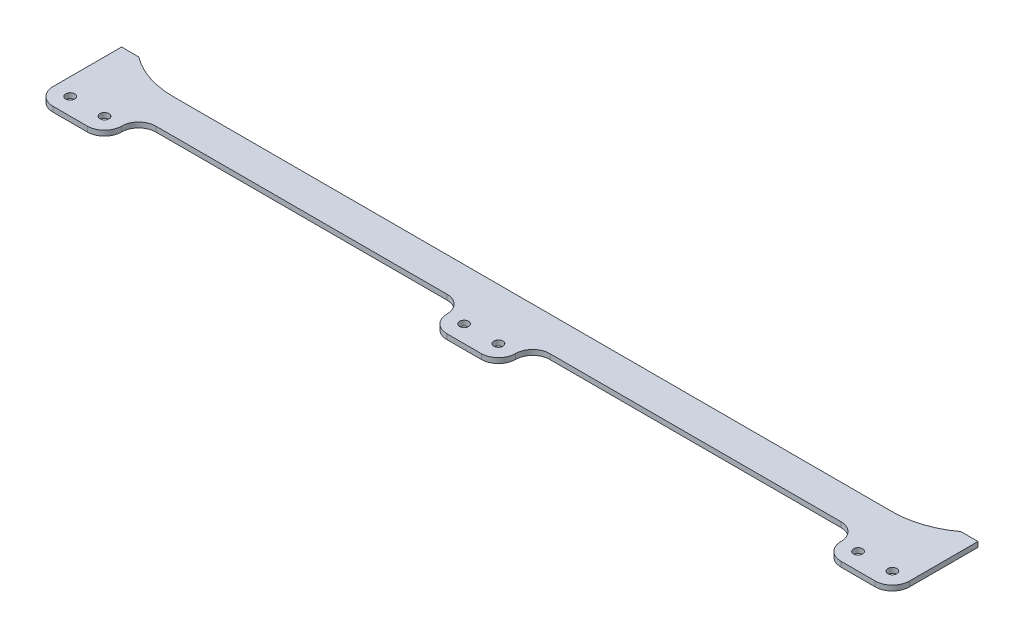
ISO-10303-21;
HEADER;
FILE_DESCRIPTION(('STEP AP214'),'2;1');
FILE_NAME('part.step','',(''),(''),'','','');
FILE_SCHEMA(('AUTOMOTIVE_DESIGN { 1 0 10303 214 1 1 1 1 }'));
ENDSEC;
DATA;
#1=APPLICATION_CONTEXT('core data for automotive mechanical design processes');
#2=APPLICATION_PROTOCOL_DEFINITION('international standard','automotive_design',2000,#1);
#3=PRODUCT_CONTEXT('',#1,'mechanical');
#4=PRODUCT('Part','Part','',(#3));
#5=PRODUCT_RELATED_PRODUCT_CATEGORY('part','',(#4));
#6=PRODUCT_DEFINITION_FORMATION('','',#4);
#7=PRODUCT_DEFINITION_CONTEXT('part definition',#1,'design');
#8=PRODUCT_DEFINITION('design','',#6,#7);
#9=PRODUCT_DEFINITION_SHAPE('','',#8);
#10=(LENGTH_UNIT() NAMED_UNIT(*) SI_UNIT(.MILLI.,.METRE.));
#11=(NAMED_UNIT(*) PLANE_ANGLE_UNIT() SI_UNIT($,.RADIAN.));
#12=(NAMED_UNIT(*) SI_UNIT($,.STERADIAN.) SOLID_ANGLE_UNIT());
#13=UNCERTAINTY_MEASURE_WITH_UNIT(LENGTH_MEASURE(1.E-05),#10,'distance_accuracy_value','');
#14=(GEOMETRIC_REPRESENTATION_CONTEXT(3) GLOBAL_UNCERTAINTY_ASSIGNED_CONTEXT((#13)) GLOBAL_UNIT_ASSIGNED_CONTEXT((#10,
#11,#12)) REPRESENTATION_CONTEXT('',''));
#15=CARTESIAN_POINT('',(0.,0.,0.));
#16=DIRECTION('',(0.,0.,1.));
#17=DIRECTION('',(1.,0.,0.));
#18=AXIS2_PLACEMENT_3D('',#15,#16,#17);
#19=CARTESIAN_POINT('',(0.,3.,15.));
#20=DIRECTION('',(0.,0.,-1.));
#21=DIRECTION('',(-1.,0.,0.));
#22=AXIS2_PLACEMENT_3D('',#19,#20,#21);
#23=PLANE('',#22);
#24=DIRECTION('',(1.,0.,0.));
#25=VECTOR('',#24,1.);
#26=CARTESIAN_POINT('',(0.,3.,15.));
#27=LINE('',#26,#25);
#28=CARTESIAN_POINT('',(-200.,3.,15.));
#29=VERTEX_POINT('',#28);
#30=CARTESIAN_POINT('',(-30.0000000000001,3.,15.));
#31=VERTEX_POINT('',#30);
#32=EDGE_CURVE('E230',#29,#31,#27,.T.);
#33=ORIENTED_EDGE('',*,*,#32,.F.);
#34=DIRECTION('',(0.,1.,0.));
#35=VECTOR('',#34,1.);
#36=CARTESIAN_POINT('',(-200.,0.,15.));
#37=LINE('',#36,#35);
#38=CARTESIAN_POINT('',(-200.,0.,15.));
#39=VERTEX_POINT('',#38);
#40=EDGE_CURVE('E293',#29,#39,#37,.F.);
#41=ORIENTED_EDGE('',*,*,#40,.T.);
#42=DIRECTION('',(1.,0.,0.));
#43=VECTOR('',#42,1.);
#44=CARTESIAN_POINT('',(0.,0.,15.));
#45=LINE('',#44,#43);
#46=CARTESIAN_POINT('',(-30.0000000000001,0.,15.));
#47=VERTEX_POINT('',#46);
#48=EDGE_CURVE('E245',#39,#47,#45,.T.);
#49=ORIENTED_EDGE('',*,*,#48,.T.);
#50=DIRECTION('',(0.,1.,0.));
#51=VECTOR('',#50,1.);
#52=CARTESIAN_POINT('',(-30.0000000000001,3.,15.));
#53=LINE('',#52,#51);
#54=EDGE_CURVE('E290',#47,#31,#53,.T.);
#55=ORIENTED_EDGE('',*,*,#54,.T.);
#56=EDGE_LOOP('',(#33,#41,#49,#55));
#57=FACE_BOUND('',#56,.T.);
#58=ADVANCED_FACE('F37',(#57),#23,.F.);
#59=CARTESIAN_POINT('',(29.9999999999999,3.,15.));
#60=VERTEX_POINT('',#59);
#61=CARTESIAN_POINT('',(200.,3.,15.));
#62=VERTEX_POINT('',#61);
#63=EDGE_CURVE('E227',#60,#62,#27,.T.);
#64=ORIENTED_EDGE('',*,*,#63,.F.);
#65=DIRECTION('',(0.,1.,0.));
#66=VECTOR('',#65,1.);
#67=CARTESIAN_POINT('',(29.9999999999999,0.,15.));
#68=LINE('',#67,#66);
#69=CARTESIAN_POINT('',(29.9999999999999,0.,15.));
#70=VERTEX_POINT('',#69);
#71=EDGE_CURVE('E303',#60,#70,#68,.F.);
#72=ORIENTED_EDGE('',*,*,#71,.T.);
#73=CARTESIAN_POINT('',(200.,0.,15.));
#74=VERTEX_POINT('',#73);
#75=EDGE_CURVE('E244',#70,#74,#45,.T.);
#76=ORIENTED_EDGE('',*,*,#75,.T.);
#77=DIRECTION('',(0.,1.,0.));
#78=VECTOR('',#77,1.);
#79=CARTESIAN_POINT('',(200.,3.,15.));
#80=LINE('',#79,#78);
#81=EDGE_CURVE('E300',#74,#62,#80,.T.);
#82=ORIENTED_EDGE('',*,*,#81,.T.);
#83=EDGE_LOOP('',(#64,#72,#76,#82));
#84=FACE_BOUND('',#83,.T.);
#85=ADVANCED_FACE('F434',(#84),#23,.F.);
#86=CARTESIAN_POINT('',(0.,3.,-5.00000000000004));
#87=DIRECTION('',(0.,0.,-1.));
#88=DIRECTION('',(-1.,0.,0.));
#89=AXIS2_PLACEMENT_3D('',#86,#87,#88);
#90=PLANE('',#89);
#91=DIRECTION('',(1.,0.,0.));
#92=VECTOR('',#91,1.);
#93=CARTESIAN_POINT('',(0.,0.,-5.00000000000004));
#94=LINE('',#93,#92);
#95=CARTESIAN_POINT('',(-210.,0.,-5.00000000000001));
#96=VERTEX_POINT('',#95);
#97=CARTESIAN_POINT('',(210.,0.,-5.00000000000006));
#98=VERTEX_POINT('',#97);
#99=EDGE_CURVE('E194',#96,#98,#94,.T.);
#100=ORIENTED_EDGE('',*,*,#99,.F.);
#101=DIRECTION('',(0.,-1.,0.));
#102=VECTOR('',#101,1.);
#103=CARTESIAN_POINT('',(-210.,3.,-5.00000000000001));
#104=LINE('',#103,#102);
#105=CARTESIAN_POINT('',(-210.,3.,-5.00000000000001));
#106=VERTEX_POINT('',#105);
#107=EDGE_CURVE('E187',#106,#96,#104,.T.);
#108=ORIENTED_EDGE('',*,*,#107,.F.);
#109=DIRECTION('',(1.,0.,0.));
#110=VECTOR('',#109,1.);
#111=CARTESIAN_POINT('',(0.,3.,-5.00000000000004));
#112=LINE('',#111,#110);
#113=CARTESIAN_POINT('',(210.,3.,-5.00000000000006));
#114=VERTEX_POINT('',#113);
#115=EDGE_CURVE('E191',#106,#114,#112,.T.);
#116=ORIENTED_EDGE('',*,*,#115,.T.);
#117=DIRECTION('',(0.,-1.,0.));
#118=VECTOR('',#117,1.);
#119=CARTESIAN_POINT('',(210.,3.,-5.00000000000006));
#120=LINE('',#119,#118);
#121=EDGE_CURVE('E234',#114,#98,#120,.T.);
#122=ORIENTED_EDGE('',*,*,#121,.T.);
#123=EDGE_LOOP('',(#100,#108,#116,#122));
#124=FACE_BOUND('',#123,.T.);
#125=ADVANCED_FACE('F189',(#124),#90,.T.);
#126=CARTESIAN_POINT('',(-210.,3.,-55.));
#127=DIRECTION('',(0.,-1.,0.));
#128=DIRECTION('',(0.,0.,-1.));
#129=AXIS2_PLACEMENT_3D('',#126,#127,#128);
#130=CYLINDRICAL_SURFACE('',#129,50.);
#131=CARTESIAN_POINT('',(-210.,0.,-55.));
#132=DIRECTION('',(0.,1.,0.));
#133=DIRECTION('',(0.,0.,1.));
#134=AXIS2_PLACEMENT_3D('',#131,#132,#133);
#135=CIRCLE('',#134,50.);
#136=CARTESIAN_POINT('',(-240.,0.,-15.));
#137=VERTEX_POINT('',#136);
#138=EDGE_CURVE('E236',#96,#137,#135,.F.);
#139=ORIENTED_EDGE('',*,*,#138,.T.);
#140=DIRECTION('',(0.,-1.,0.));
#141=VECTOR('',#140,1.);
#142=CARTESIAN_POINT('',(-240.,3.,-15.));
#143=LINE('',#142,#141);
#144=CARTESIAN_POINT('',(-240.,3.,-15.));
#145=VERTEX_POINT('',#144);
#146=EDGE_CURVE('E199',#145,#137,#143,.T.);
#147=ORIENTED_EDGE('',*,*,#146,.F.);
#148=CARTESIAN_POINT('',(-210.,3.,-55.));
#149=DIRECTION('',(0.,1.,0.));
#150=DIRECTION('',(0.,0.,1.));
#151=AXIS2_PLACEMENT_3D('',#148,#149,#150);
#152=CIRCLE('',#151,50.);
#153=EDGE_CURVE('E202',#106,#145,#152,.F.);
#154=ORIENTED_EDGE('',*,*,#153,.F.);
#155=ORIENTED_EDGE('',*,*,#107,.T.);
#156=EDGE_LOOP('',(#139,#147,#154,#155));
#157=FACE_BOUND('',#156,.T.);
#158=ADVANCED_FACE('F203',(#157),#130,.F.);
#159=CARTESIAN_POINT('',(0.,3.,-15.));
#160=DIRECTION('',(0.,0.,-1.));
#161=DIRECTION('',(-1.,0.,0.));
#162=AXIS2_PLACEMENT_3D('',#159,#160,#161);
#163=PLANE('',#162);
#164=DIRECTION('',(1.,0.,0.));
#165=VECTOR('',#164,1.);
#166=CARTESIAN_POINT('',(0.,0.,-15.));
#167=LINE('',#166,#165);
#168=CARTESIAN_POINT('',(-250.,0.,-15.));
#169=VERTEX_POINT('',#168);
#170=EDGE_CURVE('E239',#169,#137,#167,.T.);
#171=ORIENTED_EDGE('',*,*,#170,.F.);
#172=DIRECTION('',(0.,-1.,0.));
#173=VECTOR('',#172,1.);
#174=CARTESIAN_POINT('',(-250.,3.,-15.));
#175=LINE('',#174,#173);
#176=CARTESIAN_POINT('',(-250.,3.,-15.));
#177=VERTEX_POINT('',#176);
#178=EDGE_CURVE('E255',#177,#169,#175,.T.);
#179=ORIENTED_EDGE('',*,*,#178,.F.);
#180=DIRECTION('',(1.,0.,0.));
#181=VECTOR('',#180,1.);
#182=CARTESIAN_POINT('',(0.,3.,-15.));
#183=LINE('',#182,#181);
#184=EDGE_CURVE('E207',#177,#145,#183,.T.);
#185=ORIENTED_EDGE('',*,*,#184,.T.);
#186=ORIENTED_EDGE('',*,*,#146,.T.);
#187=EDGE_LOOP('',(#171,#179,#185,#186));
#188=FACE_BOUND('',#187,.T.);
#189=ADVANCED_FACE('F449',(#188),#163,.T.);
#190=CARTESIAN_POINT('',(-250.,3.,0.));
#191=DIRECTION('',(-1.,0.,0.));
#192=DIRECTION('',(0.,0.,1.));
#193=AXIS2_PLACEMENT_3D('',#190,#191,#192);
#194=PLANE('',#193);
#195=DIRECTION('',(0.,0.,-1.));
#196=VECTOR('',#195,1.);
#197=CARTESIAN_POINT('',(-250.,0.,0.));
#198=LINE('',#197,#196);
#199=CARTESIAN_POINT('',(-250.,0.,25.));
#200=VERTEX_POINT('',#199);
#201=EDGE_CURVE('E242',#200,#169,#198,.T.);
#202=ORIENTED_EDGE('',*,*,#201,.F.);
#203=DIRECTION('',(0.,1.,0.));
#204=VECTOR('',#203,1.);
#205=CARTESIAN_POINT('',(-250.,3.,25.));
#206=LINE('',#205,#204);
#207=CARTESIAN_POINT('',(-250.,3.,25.));
#208=VERTEX_POINT('',#207);
#209=EDGE_CURVE('E198',#200,#208,#206,.T.);
#210=ORIENTED_EDGE('',*,*,#209,.T.);
#211=DIRECTION('',(0.,0.,-1.));
#212=VECTOR('',#211,1.);
#213=CARTESIAN_POINT('',(-250.,3.,0.));
#214=LINE('',#213,#212);
#215=EDGE_CURVE('E224',#208,#177,#214,.T.);
#216=ORIENTED_EDGE('',*,*,#215,.T.);
#217=ORIENTED_EDGE('',*,*,#178,.T.);
#218=EDGE_LOOP('',(#202,#210,#216,#217));
#219=FACE_BOUND('',#218,.T.);
#220=ADVANCED_FACE('F446',(#219),#194,.T.);
#221=CARTESIAN_POINT('',(250.,3.,0.));
#222=DIRECTION('',(-1.,0.,0.));
#223=DIRECTION('',(0.,0.,1.));
#224=AXIS2_PLACEMENT_3D('',#221,#222,#223);
#225=PLANE('',#224);
#226=DIRECTION('',(0.,0.,-1.));
#227=VECTOR('',#226,1.);
#228=CARTESIAN_POINT('',(250.,3.,0.));
#229=LINE('',#228,#227);
#230=CARTESIAN_POINT('',(250.,3.,25.));
#231=VERTEX_POINT('',#230);
#232=CARTESIAN_POINT('',(250.,3.,-15.));
#233=VERTEX_POINT('',#232);
#234=EDGE_CURVE('E231',#231,#233,#229,.T.);
#235=ORIENTED_EDGE('',*,*,#234,.F.);
#236=DIRECTION('',(0.,1.,0.));
#237=VECTOR('',#236,1.);
#238=CARTESIAN_POINT('',(250.,3.,25.));
#239=LINE('',#238,#237);
#240=CARTESIAN_POINT('',(250.,0.,25.));
#241=VERTEX_POINT('',#240);
#242=EDGE_CURVE('E310',#231,#241,#239,.F.);
#243=ORIENTED_EDGE('',*,*,#242,.T.);
#244=DIRECTION('',(0.,0.,-1.));
#245=VECTOR('',#244,1.);
#246=CARTESIAN_POINT('',(250.,0.,0.));
#247=LINE('',#246,#245);
#248=CARTESIAN_POINT('',(250.,0.,-15.));
#249=VERTEX_POINT('',#248);
#250=EDGE_CURVE('E247',#241,#249,#247,.T.);
#251=ORIENTED_EDGE('',*,*,#250,.T.);
#252=DIRECTION('',(0.,-1.,0.));
#253=VECTOR('',#252,1.);
#254=CARTESIAN_POINT('',(250.,3.,-15.));
#255=LINE('',#254,#253);
#256=EDGE_CURVE('E252',#233,#249,#255,.T.);
#257=ORIENTED_EDGE('',*,*,#256,.F.);
#258=EDGE_LOOP('',(#235,#243,#251,#257));
#259=FACE_BOUND('',#258,.T.);
#260=ADVANCED_FACE('F444',(#259),#225,.F.);
#261=CARTESIAN_POINT('',(240.,0.,-15.));
#262=VERTEX_POINT('',#261);
#263=EDGE_CURVE('E217',#262,#249,#167,.T.);
#264=ORIENTED_EDGE('',*,*,#263,.F.);
#265=DIRECTION('',(0.,-1.,0.));
#266=VECTOR('',#265,1.);
#267=CARTESIAN_POINT('',(240.,3.,-15.));
#268=LINE('',#267,#266);
#269=CARTESIAN_POINT('',(240.,3.,-15.));
#270=VERTEX_POINT('',#269);
#271=EDGE_CURVE('E250',#270,#262,#268,.T.);
#272=ORIENTED_EDGE('',*,*,#271,.F.);
#273=EDGE_CURVE('E225',#270,#233,#183,.T.);
#274=ORIENTED_EDGE('',*,*,#273,.T.);
#275=ORIENTED_EDGE('',*,*,#256,.T.);
#276=EDGE_LOOP('',(#264,#272,#274,#275));
#277=FACE_BOUND('',#276,.T.);
#278=ADVANCED_FACE('F655',(#277),#163,.T.);
#279=CARTESIAN_POINT('',(210.,3.,-55.));
#280=DIRECTION('',(0.,-1.,0.));
#281=DIRECTION('',(0.,0.,-1.));
#282=AXIS2_PLACEMENT_3D('',#279,#280,#281);
#283=CYLINDRICAL_SURFACE('',#282,50.);
#284=CARTESIAN_POINT('',(210.,0.,-55.));
#285=DIRECTION('',(0.,1.,0.));
#286=DIRECTION('',(0.,0.,1.));
#287=AXIS2_PLACEMENT_3D('',#284,#285,#286);
#288=CIRCLE('',#287,50.);
#289=EDGE_CURVE('E214',#98,#262,#288,.T.);
#290=ORIENTED_EDGE('',*,*,#289,.F.);
#291=ORIENTED_EDGE('',*,*,#121,.F.);
#292=CARTESIAN_POINT('',(210.,3.,-55.));
#293=DIRECTION('',(0.,1.,0.));
#294=DIRECTION('',(0.,0.,1.));
#295=AXIS2_PLACEMENT_3D('',#292,#293,#294);
#296=CIRCLE('',#295,50.);
#297=EDGE_CURVE('E213',#114,#270,#296,.T.);
#298=ORIENTED_EDGE('',*,*,#297,.T.);
#299=ORIENTED_EDGE('',*,*,#271,.T.);
#300=EDGE_LOOP('',(#290,#291,#298,#299));
#301=FACE_BOUND('',#300,.T.);
#302=ADVANCED_FACE('F408',(#301),#283,.F.);
#303=CARTESIAN_POINT('',(0.,3.,0.));
#304=DIRECTION('',(0.,1.,0.));
#305=DIRECTION('',(0.,0.,1.));
#306=AXIS2_PLACEMENT_3D('',#303,#304,#305);
#307=PLANE('',#306);
#308=CARTESIAN_POINT('',(-240.,3.,25.));
#309=DIRECTION('',(0.,1.,0.));
#310=DIRECTION('',(0.,0.,1.));
#311=AXIS2_PLACEMENT_3D('',#308,#309,#310);
#312=CIRCLE('',#311,2.65000000000001);
#313=CARTESIAN_POINT('',(-240.,3.,27.65));
#314=VERTEX_POINT('',#313);
#315=EDGE_CURVE('E326',#314,#314,#312,.T.);
#316=ORIENTED_EDGE('',*,*,#315,.F.);
#317=EDGE_LOOP('',(#316));
#318=FACE_BOUND('',#317,.T.);
#319=CARTESIAN_POINT('',(-220.,3.,25.));
#320=DIRECTION('',(0.,1.,0.));
#321=DIRECTION('',(0.,0.,1.));
#322=AXIS2_PLACEMENT_3D('',#319,#320,#321);
#323=CIRCLE('',#322,2.64999999999999);
#324=CARTESIAN_POINT('',(-220.,3.,27.65));
#325=VERTEX_POINT('',#324);
#326=EDGE_CURVE('E394',#325,#325,#323,.T.);
#327=ORIENTED_EDGE('',*,*,#326,.F.);
#328=EDGE_LOOP('',(#327));
#329=FACE_BOUND('',#328,.T.);
#330=CARTESIAN_POINT('',(-10.0000000000001,3.,25.));
#331=DIRECTION('',(0.,1.,0.));
#332=DIRECTION('',(0.,0.,1.));
#333=AXIS2_PLACEMENT_3D('',#330,#331,#332);
#334=CIRCLE('',#333,2.65);
#335=CARTESIAN_POINT('',(-10.0000000000001,3.,27.65));
#336=VERTEX_POINT('',#335);
#337=EDGE_CURVE('E388',#336,#336,#334,.T.);
#338=ORIENTED_EDGE('',*,*,#337,.F.);
#339=EDGE_LOOP('',(#338));
#340=FACE_BOUND('',#339,.T.);
#341=CARTESIAN_POINT('',(9.99999999999987,3.,25.));
#342=DIRECTION('',(0.,1.,0.));
#343=DIRECTION('',(0.,0.,1.));
#344=AXIS2_PLACEMENT_3D('',#341,#342,#343);
#345=CIRCLE('',#344,2.65);
#346=CARTESIAN_POINT('',(9.99999999999987,3.,27.65));
#347=VERTEX_POINT('',#346);
#348=EDGE_CURVE('E382',#347,#347,#345,.T.);
#349=ORIENTED_EDGE('',*,*,#348,.F.);
#350=EDGE_LOOP('',(#349));
#351=FACE_BOUND('',#350,.T.);
#352=CARTESIAN_POINT('',(220.,3.,25.));
#353=DIRECTION('',(0.,1.,0.));
#354=DIRECTION('',(0.,0.,1.));
#355=AXIS2_PLACEMENT_3D('',#352,#353,#354);
#356=CIRCLE('',#355,2.65000000000001);
#357=CARTESIAN_POINT('',(220.,3.,27.65));
#358=VERTEX_POINT('',#357);
#359=EDGE_CURVE('E364',#358,#358,#356,.T.);
#360=ORIENTED_EDGE('',*,*,#359,.F.);
#361=EDGE_LOOP('',(#360));
#362=FACE_BOUND('',#361,.T.);
#363=CARTESIAN_POINT('',(240.,3.,25.));
#364=DIRECTION('',(0.,1.,0.));
#365=DIRECTION('',(0.,0.,1.));
#366=AXIS2_PLACEMENT_3D('',#363,#364,#365);
#367=CIRCLE('',#366,2.64999999999999);
#368=CARTESIAN_POINT('',(240.,3.,27.65));
#369=VERTEX_POINT('',#368);
#370=EDGE_CURVE('E354',#369,#369,#367,.T.);
#371=ORIENTED_EDGE('',*,*,#370,.F.);
#372=EDGE_LOOP('',(#371));
#373=FACE_BOUND('',#372,.T.);
#374=ORIENTED_EDGE('',*,*,#215,.F.);
#375=CARTESIAN_POINT('',(-240.,3.,25.));
#376=DIRECTION('',(0.,1.,0.));
#377=DIRECTION('',(0.,0.,1.));
#378=AXIS2_PLACEMENT_3D('',#375,#376,#377);
#379=CIRCLE('',#378,10.);
#380=CARTESIAN_POINT('',(-240.,3.,35.));
#381=VERTEX_POINT('',#380);
#382=EDGE_CURVE('E271',#208,#381,#379,.T.);
#383=ORIENTED_EDGE('',*,*,#382,.T.);
#384=DIRECTION('',(-1.,0.,0.));
#385=VECTOR('',#384,1.);
#386=CARTESIAN_POINT('',(-210.,3.,35.));
#387=LINE('',#386,#385);
#388=CARTESIAN_POINT('',(-220.,3.,35.));
#389=VERTEX_POINT('',#388);
#390=EDGE_CURVE('E374',#389,#381,#387,.T.);
#391=ORIENTED_EDGE('',*,*,#390,.F.);
#392=CARTESIAN_POINT('',(-220.,3.,25.));
#393=DIRECTION('',(0.,1.,0.));
#394=DIRECTION('',(0.,0.,1.));
#395=AXIS2_PLACEMENT_3D('',#392,#393,#394);
#396=CIRCLE('',#395,10.);
#397=CARTESIAN_POINT('',(-210.,3.,25.));
#398=VERTEX_POINT('',#397);
#399=EDGE_CURVE('E269',#389,#398,#396,.T.);
#400=ORIENTED_EDGE('',*,*,#399,.T.);
#401=CARTESIAN_POINT('',(-200.,3.,25.));
#402=DIRECTION('',(0.,1.,0.));
#403=DIRECTION('',(0.,0.,1.));
#404=AXIS2_PLACEMENT_3D('',#401,#402,#403);
#405=CIRCLE('',#404,10.);
#406=EDGE_CURVE('E312',#398,#29,#405,.F.);
#407=ORIENTED_EDGE('',*,*,#406,.T.);
#408=ORIENTED_EDGE('',*,*,#32,.T.);
#409=CARTESIAN_POINT('',(-30.0000000000001,3.,25.));
#410=DIRECTION('',(0.,1.,0.));
#411=DIRECTION('',(0.,0.,1.));
#412=AXIS2_PLACEMENT_3D('',#409,#410,#411);
#413=CIRCLE('',#412,10.);
#414=CARTESIAN_POINT('',(-20.0000000000001,3.,25.));
#415=VERTEX_POINT('',#414);
#416=EDGE_CURVE('E315',#31,#415,#413,.F.);
#417=ORIENTED_EDGE('',*,*,#416,.T.);
#418=CARTESIAN_POINT('',(-10.0000000000001,3.,25.));
#419=DIRECTION('',(0.,1.,0.));
#420=DIRECTION('',(0.,0.,1.));
#421=AXIS2_PLACEMENT_3D('',#418,#419,#420);
#422=CIRCLE('',#421,10.);
#423=CARTESIAN_POINT('',(-10.0000000000001,3.,35.));
#424=VERTEX_POINT('',#423);
#425=EDGE_CURVE('E267',#415,#424,#422,.T.);
#426=ORIENTED_EDGE('',*,*,#425,.T.);
#427=DIRECTION('',(-1.,0.,0.));
#428=VECTOR('',#427,1.);
#429=CARTESIAN_POINT('',(19.9999999999999,3.,35.));
#430=LINE('',#429,#428);
#431=CARTESIAN_POINT('',(9.99999999999985,3.,35.));
#432=VERTEX_POINT('',#431);
#433=EDGE_CURVE('E368',#432,#424,#430,.T.);
#434=ORIENTED_EDGE('',*,*,#433,.F.);
#435=CARTESIAN_POINT('',(9.99999999999985,3.,25.));
#436=DIRECTION('',(0.,1.,0.));
#437=DIRECTION('',(0.,0.,1.));
#438=AXIS2_PLACEMENT_3D('',#435,#436,#437);
#439=CIRCLE('',#438,10.);
#440=CARTESIAN_POINT('',(19.9999999999999,3.,25.));
#441=VERTEX_POINT('',#440);
#442=EDGE_CURVE('E265',#432,#441,#439,.T.);
#443=ORIENTED_EDGE('',*,*,#442,.T.);
#444=CARTESIAN_POINT('',(29.9999999999999,3.,25.));
#445=DIRECTION('',(0.,1.,0.));
#446=DIRECTION('',(0.,0.,1.));
#447=AXIS2_PLACEMENT_3D('',#444,#445,#446);
#448=CIRCLE('',#447,10.);
#449=EDGE_CURVE('E318',#441,#60,#448,.F.);
#450=ORIENTED_EDGE('',*,*,#449,.T.);
#451=ORIENTED_EDGE('',*,*,#63,.T.);
#452=CARTESIAN_POINT('',(200.,3.,25.));
#453=DIRECTION('',(0.,1.,0.));
#454=DIRECTION('',(0.,0.,1.));
#455=AXIS2_PLACEMENT_3D('',#452,#453,#454);
#456=CIRCLE('',#455,10.);
#457=CARTESIAN_POINT('',(210.,3.,25.));
#458=VERTEX_POINT('',#457);
#459=EDGE_CURVE('E46',#62,#458,#456,.F.);
#460=ORIENTED_EDGE('',*,*,#459,.T.);
#461=CARTESIAN_POINT('',(220.,3.,25.));
#462=DIRECTION('',(0.,1.,0.));
#463=DIRECTION('',(0.,0.,1.));
#464=AXIS2_PLACEMENT_3D('',#461,#462,#463);
#465=CIRCLE('',#464,10.);
#466=CARTESIAN_POINT('',(220.,3.,35.));
#467=VERTEX_POINT('',#466);
#468=EDGE_CURVE('E261',#458,#467,#465,.T.);
#469=ORIENTED_EDGE('',*,*,#468,.T.);
#470=DIRECTION('',(-1.,0.,0.));
#471=VECTOR('',#470,1.);
#472=CARTESIAN_POINT('',(250.,3.,35.));
#473=LINE('',#472,#471);
#474=CARTESIAN_POINT('',(240.,3.,35.));
#475=VERTEX_POINT('',#474);
#476=EDGE_CURVE('E220',#475,#467,#473,.T.);
#477=ORIENTED_EDGE('',*,*,#476,.F.);
#478=CARTESIAN_POINT('',(240.,3.,25.));
#479=DIRECTION('',(0.,1.,0.));
#480=DIRECTION('',(0.,0.,1.));
#481=AXIS2_PLACEMENT_3D('',#478,#479,#480);
#482=CIRCLE('',#481,10.);
#483=EDGE_CURVE('E263',#475,#231,#482,.T.);
#484=ORIENTED_EDGE('',*,*,#483,.T.);
#485=ORIENTED_EDGE('',*,*,#234,.T.);
#486=ORIENTED_EDGE('',*,*,#273,.F.);
#487=ORIENTED_EDGE('',*,*,#297,.F.);
#488=ORIENTED_EDGE('',*,*,#115,.F.);
#489=ORIENTED_EDGE('',*,*,#153,.T.);
#490=ORIENTED_EDGE('',*,*,#184,.F.);
#491=EDGE_LOOP('',(#374,#383,#391,#400,#407,#408,#417,#426,#434,#443,#450,#451,#460,#469,#477,
#484,#485,#486,#487,#488,#489,#490));
#492=FACE_BOUND('',#491,.T.);
#493=ADVANCED_FACE('F210',(#318,#329,#340,#351,#362,#373,#492),#307,.T.);
#494=CARTESIAN_POINT('',(0.,0.,0.));
#495=DIRECTION('',(0.,1.,0.));
#496=DIRECTION('',(0.,0.,1.));
#497=AXIS2_PLACEMENT_3D('',#494,#495,#496);
#498=PLANE('',#497);
#499=CARTESIAN_POINT('',(-240.,0.,25.));
#500=DIRECTION('',(0.,1.,0.));
#501=DIRECTION('',(0.,0.,1.));
#502=AXIS2_PLACEMENT_3D('',#499,#500,#501);
#503=CIRCLE('',#502,2.65000000000001);
#504=CARTESIAN_POINT('',(-240.,0.,27.65));
#505=VERTEX_POINT('',#504);
#506=EDGE_CURVE('E397',#505,#505,#503,.T.);
#507=ORIENTED_EDGE('',*,*,#506,.T.);
#508=EDGE_LOOP('',(#507));
#509=FACE_BOUND('',#508,.T.);
#510=CARTESIAN_POINT('',(-220.,0.,25.));
#511=DIRECTION('',(0.,1.,0.));
#512=DIRECTION('',(0.,0.,1.));
#513=AXIS2_PLACEMENT_3D('',#510,#511,#512);
#514=CIRCLE('',#513,2.64999999999999);
#515=CARTESIAN_POINT('',(-220.,0.,27.65));
#516=VERTEX_POINT('',#515);
#517=EDGE_CURVE('E391',#516,#516,#514,.T.);
#518=ORIENTED_EDGE('',*,*,#517,.T.);
#519=EDGE_LOOP('',(#518));
#520=FACE_BOUND('',#519,.T.);
#521=CARTESIAN_POINT('',(-10.0000000000001,0.,25.));
#522=DIRECTION('',(0.,1.,0.));
#523=DIRECTION('',(0.,0.,1.));
#524=AXIS2_PLACEMENT_3D('',#521,#522,#523);
#525=CIRCLE('',#524,2.65);
#526=CARTESIAN_POINT('',(-10.0000000000001,0.,27.65));
#527=VERTEX_POINT('',#526);
#528=EDGE_CURVE('E385',#527,#527,#525,.T.);
#529=ORIENTED_EDGE('',*,*,#528,.T.);
#530=EDGE_LOOP('',(#529));
#531=FACE_BOUND('',#530,.T.);
#532=CARTESIAN_POINT('',(9.99999999999987,0.,25.));
#533=DIRECTION('',(0.,1.,0.));
#534=DIRECTION('',(0.,0.,1.));
#535=AXIS2_PLACEMENT_3D('',#532,#533,#534);
#536=CIRCLE('',#535,2.65);
#537=CARTESIAN_POINT('',(9.99999999999987,0.,27.65));
#538=VERTEX_POINT('',#537);
#539=EDGE_CURVE('E377',#538,#538,#536,.T.);
#540=ORIENTED_EDGE('',*,*,#539,.T.);
#541=EDGE_LOOP('',(#540));
#542=FACE_BOUND('',#541,.T.);
#543=CARTESIAN_POINT('',(220.,0.,25.));
#544=DIRECTION('',(0.,1.,0.));
#545=DIRECTION('',(0.,0.,1.));
#546=AXIS2_PLACEMENT_3D('',#543,#544,#545);
#547=CIRCLE('',#546,2.65000000000001);
#548=CARTESIAN_POINT('',(220.,0.,27.65));
#549=VERTEX_POINT('',#548);
#550=EDGE_CURVE('E359',#549,#549,#547,.T.);
#551=ORIENTED_EDGE('',*,*,#550,.T.);
#552=EDGE_LOOP('',(#551));
#553=FACE_BOUND('',#552,.T.);
#554=CARTESIAN_POINT('',(240.,0.,25.));
#555=DIRECTION('',(0.,1.,0.));
#556=DIRECTION('',(0.,0.,1.));
#557=AXIS2_PLACEMENT_3D('',#554,#555,#556);
#558=CIRCLE('',#557,2.64999999999999);
#559=CARTESIAN_POINT('',(240.,0.,27.65));
#560=VERTEX_POINT('',#559);
#561=EDGE_CURVE('E352',#560,#560,#558,.T.);
#562=ORIENTED_EDGE('',*,*,#561,.T.);
#563=EDGE_LOOP('',(#562));
#564=FACE_BOUND('',#563,.T.);
#565=DIRECTION('',(-1.,0.,0.));
#566=VECTOR('',#565,1.);
#567=CARTESIAN_POINT('',(-210.,0.,35.));
#568=LINE('',#567,#566);
#569=CARTESIAN_POINT('',(-220.,0.,35.));
#570=VERTEX_POINT('',#569);
#571=CARTESIAN_POINT('',(-240.,0.,35.));
#572=VERTEX_POINT('',#571);
#573=EDGE_CURVE('E371',#570,#572,#568,.T.);
#574=ORIENTED_EDGE('',*,*,#573,.T.);
#575=CARTESIAN_POINT('',(-240.,0.,25.));
#576=DIRECTION('',(0.,1.,0.));
#577=DIRECTION('',(0.,0.,1.));
#578=AXIS2_PLACEMENT_3D('',#575,#576,#577);
#579=CIRCLE('',#578,10.);
#580=EDGE_CURVE('E288',#572,#200,#579,.F.);
#581=ORIENTED_EDGE('',*,*,#580,.T.);
#582=ORIENTED_EDGE('',*,*,#201,.T.);
#583=ORIENTED_EDGE('',*,*,#170,.T.);
#584=ORIENTED_EDGE('',*,*,#138,.F.);
#585=ORIENTED_EDGE('',*,*,#99,.T.);
#586=ORIENTED_EDGE('',*,*,#289,.T.);
#587=ORIENTED_EDGE('',*,*,#263,.T.);
#588=ORIENTED_EDGE('',*,*,#250,.F.);
#589=CARTESIAN_POINT('',(240.,0.,25.));
#590=DIRECTION('',(0.,1.,0.));
#591=DIRECTION('',(0.,0.,1.));
#592=AXIS2_PLACEMENT_3D('',#589,#590,#591);
#593=CIRCLE('',#592,10.);
#594=CARTESIAN_POINT('',(240.,0.,35.));
#595=VERTEX_POINT('',#594);
#596=EDGE_CURVE('E280',#241,#595,#593,.F.);
#597=ORIENTED_EDGE('',*,*,#596,.T.);
#598=DIRECTION('',(-1.,0.,0.));
#599=VECTOR('',#598,1.);
#600=CARTESIAN_POINT('',(250.,0.,35.));
#601=LINE('',#600,#599);
#602=CARTESIAN_POINT('',(220.,0.,35.));
#603=VERTEX_POINT('',#602);
#604=EDGE_CURVE('E237',#595,#603,#601,.T.);
#605=ORIENTED_EDGE('',*,*,#604,.T.);
#606=CARTESIAN_POINT('',(220.,0.,25.));
#607=DIRECTION('',(0.,1.,0.));
#608=DIRECTION('',(0.,0.,1.));
#609=AXIS2_PLACEMENT_3D('',#606,#607,#608);
#610=CIRCLE('',#609,10.);
#611=CARTESIAN_POINT('',(210.,0.,25.));
#612=VERTEX_POINT('',#611);
#613=EDGE_CURVE('E278',#603,#612,#610,.F.);
#614=ORIENTED_EDGE('',*,*,#613,.T.);
#615=CARTESIAN_POINT('',(200.,0.,25.));
#616=DIRECTION('',(0.,1.,0.));
#617=DIRECTION('',(0.,0.,1.));
#618=AXIS2_PLACEMENT_3D('',#615,#616,#617);
#619=CIRCLE('',#618,10.);
#620=EDGE_CURVE('E11',#612,#74,#619,.T.);
#621=ORIENTED_EDGE('',*,*,#620,.T.);
#622=ORIENTED_EDGE('',*,*,#75,.F.);
#623=CARTESIAN_POINT('',(29.9999999999999,0.,25.));
#624=DIRECTION('',(0.,1.,0.));
#625=DIRECTION('',(0.,0.,1.));
#626=AXIS2_PLACEMENT_3D('',#623,#624,#625);
#627=CIRCLE('',#626,10.);
#628=CARTESIAN_POINT('',(19.9999999999999,0.,25.));
#629=VERTEX_POINT('',#628);
#630=EDGE_CURVE('E320',#70,#629,#627,.T.);
#631=ORIENTED_EDGE('',*,*,#630,.T.);
#632=CARTESIAN_POINT('',(9.99999999999985,0.,25.));
#633=DIRECTION('',(0.,1.,0.));
#634=DIRECTION('',(0.,0.,1.));
#635=AXIS2_PLACEMENT_3D('',#632,#633,#634);
#636=CIRCLE('',#635,10.);
#637=CARTESIAN_POINT('',(9.99999999999985,0.,35.));
#638=VERTEX_POINT('',#637);
#639=EDGE_CURVE('E282',#629,#638,#636,.F.);
#640=ORIENTED_EDGE('',*,*,#639,.T.);
#641=DIRECTION('',(-1.,0.,0.));
#642=VECTOR('',#641,1.);
#643=CARTESIAN_POINT('',(19.9999999999999,0.,35.));
#644=LINE('',#643,#642);
#645=CARTESIAN_POINT('',(-10.0000000000001,0.,35.));
#646=VERTEX_POINT('',#645);
#647=EDGE_CURVE('E367',#638,#646,#644,.T.);
#648=ORIENTED_EDGE('',*,*,#647,.T.);
#649=CARTESIAN_POINT('',(-10.0000000000001,0.,25.));
#650=DIRECTION('',(0.,1.,0.));
#651=DIRECTION('',(0.,0.,1.));
#652=AXIS2_PLACEMENT_3D('',#649,#650,#651);
#653=CIRCLE('',#652,10.);
#654=CARTESIAN_POINT('',(-20.0000000000001,0.,25.));
#655=VERTEX_POINT('',#654);
#656=EDGE_CURVE('E284',#646,#655,#653,.F.);
#657=ORIENTED_EDGE('',*,*,#656,.T.);
#658=CARTESIAN_POINT('',(-30.0000000000001,0.,25.));
#659=DIRECTION('',(0.,1.,0.));
#660=DIRECTION('',(0.,0.,1.));
#661=AXIS2_PLACEMENT_3D('',#658,#659,#660);
#662=CIRCLE('',#661,10.);
#663=EDGE_CURVE('E60',#655,#47,#662,.T.);
#664=ORIENTED_EDGE('',*,*,#663,.T.);
#665=ORIENTED_EDGE('',*,*,#48,.F.);
#666=CARTESIAN_POINT('',(-200.,0.,25.));
#667=DIRECTION('',(0.,1.,0.));
#668=DIRECTION('',(0.,0.,1.));
#669=AXIS2_PLACEMENT_3D('',#666,#667,#668);
#670=CIRCLE('',#669,10.);
#671=CARTESIAN_POINT('',(-210.,0.,25.));
#672=VERTEX_POINT('',#671);
#673=EDGE_CURVE('E54',#39,#672,#670,.T.);
#674=ORIENTED_EDGE('',*,*,#673,.T.);
#675=CARTESIAN_POINT('',(-220.,0.,25.));
#676=DIRECTION('',(0.,1.,0.));
#677=DIRECTION('',(0.,0.,1.));
#678=AXIS2_PLACEMENT_3D('',#675,#676,#677);
#679=CIRCLE('',#678,10.);
#680=EDGE_CURVE('E286',#672,#570,#679,.F.);
#681=ORIENTED_EDGE('',*,*,#680,.T.);
#682=EDGE_LOOP('',(#574,#581,#582,#583,#584,#585,#586,#587,#588,#597,#605,#614,#621,#622,#631,
#640,#648,#657,#664,#665,#674,#681));
#683=FACE_BOUND('',#682,.T.);
#684=ADVANCED_FACE('F407',(#509,#520,#531,#542,#553,#564,#683),#498,.F.);
#685=CARTESIAN_POINT('',(250.,0.,35.));
#686=DIRECTION('',(0.,0.,-1.));
#687=DIRECTION('',(-1.,0.,0.));
#688=AXIS2_PLACEMENT_3D('',#685,#686,#687);
#689=PLANE('',#688);
#690=ORIENTED_EDGE('',*,*,#604,.F.);
#691=DIRECTION('',(0.,1.,0.));
#692=VECTOR('',#691,1.);
#693=CARTESIAN_POINT('',(240.,0.,35.));
#694=LINE('',#693,#692);
#695=EDGE_CURVE('E307',#595,#475,#694,.T.);
#696=ORIENTED_EDGE('',*,*,#695,.T.);
#697=ORIENTED_EDGE('',*,*,#476,.T.);
#698=DIRECTION('',(0.,1.,0.));
#699=VECTOR('',#698,1.);
#700=CARTESIAN_POINT('',(220.,0.,35.));
#701=LINE('',#700,#699);
#702=EDGE_CURVE('E305',#467,#603,#701,.F.);
#703=ORIENTED_EDGE('',*,*,#702,.T.);
#704=EDGE_LOOP('',(#690,#696,#697,#703));
#705=FACE_BOUND('',#704,.T.);
#706=ADVANCED_FACE('F349',(#705),#689,.F.);
#707=CARTESIAN_POINT('',(240.,3.,25.));
#708=DIRECTION('',(0.,1.,0.));
#709=DIRECTION('',(0.,0.,1.));
#710=AXIS2_PLACEMENT_3D('',#707,#708,#709);
#711=CYLINDRICAL_SURFACE('',#710,2.64999999999999);
#712=ORIENTED_EDGE('',*,*,#561,.F.);
#713=EDGE_LOOP('',(#712));
#714=FACE_BOUND('',#713,.T.);
#715=ORIENTED_EDGE('',*,*,#370,.T.);
#716=EDGE_LOOP('',(#715));
#717=FACE_BOUND('',#716,.T.);
#718=ADVANCED_FACE('F420',(#714,#717),#711,.F.);
#719=CARTESIAN_POINT('',(220.,3.,25.));
#720=DIRECTION('',(0.,1.,0.));
#721=DIRECTION('',(0.,0.,1.));
#722=AXIS2_PLACEMENT_3D('',#719,#720,#721);
#723=CYLINDRICAL_SURFACE('',#722,2.65000000000001);
#724=ORIENTED_EDGE('',*,*,#550,.F.);
#725=EDGE_LOOP('',(#724));
#726=FACE_BOUND('',#725,.T.);
#727=ORIENTED_EDGE('',*,*,#359,.T.);
#728=EDGE_LOOP('',(#727));
#729=FACE_BOUND('',#728,.T.);
#730=ADVANCED_FACE('F422',(#726,#729),#723,.F.);
#731=CARTESIAN_POINT('',(19.9999999999999,0.,35.));
#732=DIRECTION('',(0.,0.,-1.));
#733=DIRECTION('',(-1.,0.,0.));
#734=AXIS2_PLACEMENT_3D('',#731,#732,#733);
#735=PLANE('',#734);
#736=ORIENTED_EDGE('',*,*,#433,.T.);
#737=DIRECTION('',(0.,1.,0.));
#738=VECTOR('',#737,1.);
#739=CARTESIAN_POINT('',(-10.0000000000001,0.,35.));
#740=LINE('',#739,#738);
#741=EDGE_CURVE('E298',#424,#646,#740,.F.);
#742=ORIENTED_EDGE('',*,*,#741,.T.);
#743=ORIENTED_EDGE('',*,*,#647,.F.);
#744=DIRECTION('',(0.,1.,0.));
#745=VECTOR('',#744,1.);
#746=CARTESIAN_POINT('',(9.99999999999985,0.,35.));
#747=LINE('',#746,#745);
#748=EDGE_CURVE('E295',#638,#432,#747,.T.);
#749=ORIENTED_EDGE('',*,*,#748,.T.);
#750=EDGE_LOOP('',(#736,#742,#743,#749));
#751=FACE_BOUND('',#750,.T.);
#752=ADVANCED_FACE('F429',(#751),#735,.F.);
#753=CARTESIAN_POINT('',(-210.,0.,35.));
#754=DIRECTION('',(0.,0.,-1.));
#755=DIRECTION('',(-1.,0.,0.));
#756=AXIS2_PLACEMENT_3D('',#753,#754,#755);
#757=PLANE('',#756);
#758=ORIENTED_EDGE('',*,*,#390,.T.);
#759=DIRECTION('',(0.,1.,0.));
#760=VECTOR('',#759,1.);
#761=CARTESIAN_POINT('',(-240.,0.,35.));
#762=LINE('',#761,#760);
#763=EDGE_CURVE('E276',#381,#572,#762,.F.);
#764=ORIENTED_EDGE('',*,*,#763,.T.);
#765=ORIENTED_EDGE('',*,*,#573,.F.);
#766=DIRECTION('',(0.,1.,0.));
#767=VECTOR('',#766,1.);
#768=CARTESIAN_POINT('',(-220.,0.,35.));
#769=LINE('',#768,#767);
#770=EDGE_CURVE('E273',#570,#389,#769,.T.);
#771=ORIENTED_EDGE('',*,*,#770,.T.);
#772=EDGE_LOOP('',(#758,#764,#765,#771));
#773=FACE_BOUND('',#772,.T.);
#774=ADVANCED_FACE('F574',(#773),#757,.F.);
#775=CARTESIAN_POINT('',(9.99999999999987,3.,25.));
#776=DIRECTION('',(0.,1.,0.));
#777=DIRECTION('',(0.,0.,1.));
#778=AXIS2_PLACEMENT_3D('',#775,#776,#777);
#779=CYLINDRICAL_SURFACE('',#778,2.65);
#780=ORIENTED_EDGE('',*,*,#539,.F.);
#781=EDGE_LOOP('',(#780));
#782=FACE_BOUND('',#781,.T.);
#783=ORIENTED_EDGE('',*,*,#348,.T.);
#784=EDGE_LOOP('',(#783));
#785=FACE_BOUND('',#784,.T.);
#786=ADVANCED_FACE('F565',(#782,#785),#779,.F.);
#787=CARTESIAN_POINT('',(-10.0000000000001,3.,25.));
#788=DIRECTION('',(0.,1.,0.));
#789=DIRECTION('',(0.,0.,1.));
#790=AXIS2_PLACEMENT_3D('',#787,#788,#789);
#791=CYLINDRICAL_SURFACE('',#790,2.65);
#792=ORIENTED_EDGE('',*,*,#528,.F.);
#793=EDGE_LOOP('',(#792));
#794=FACE_BOUND('',#793,.T.);
#795=ORIENTED_EDGE('',*,*,#337,.T.);
#796=EDGE_LOOP('',(#795));
#797=FACE_BOUND('',#796,.T.);
#798=ADVANCED_FACE('F556',(#794,#797),#791,.F.);
#799=CARTESIAN_POINT('',(-220.,3.,25.));
#800=DIRECTION('',(0.,1.,0.));
#801=DIRECTION('',(0.,0.,1.));
#802=AXIS2_PLACEMENT_3D('',#799,#800,#801);
#803=CYLINDRICAL_SURFACE('',#802,2.64999999999999);
#804=ORIENTED_EDGE('',*,*,#517,.F.);
#805=EDGE_LOOP('',(#804));
#806=FACE_BOUND('',#805,.T.);
#807=ORIENTED_EDGE('',*,*,#326,.T.);
#808=EDGE_LOOP('',(#807));
#809=FACE_BOUND('',#808,.T.);
#810=ADVANCED_FACE('F547',(#806,#809),#803,.F.);
#811=CARTESIAN_POINT('',(-240.,3.,25.));
#812=DIRECTION('',(0.,1.,0.));
#813=DIRECTION('',(0.,0.,1.));
#814=AXIS2_PLACEMENT_3D('',#811,#812,#813);
#815=CYLINDRICAL_SURFACE('',#814,2.65000000000001);
#816=ORIENTED_EDGE('',*,*,#506,.F.);
#817=EDGE_LOOP('',(#816));
#818=FACE_BOUND('',#817,.T.);
#819=ORIENTED_EDGE('',*,*,#315,.T.);
#820=EDGE_LOOP('',(#819));
#821=FACE_BOUND('',#820,.T.);
#822=ADVANCED_FACE('F403',(#818,#821),#815,.F.);
#823=CARTESIAN_POINT('',(-240.,3.,25.));
#824=DIRECTION('',(0.,-1.,0.));
#825=DIRECTION('',(0.,0.,-1.));
#826=AXIS2_PLACEMENT_3D('',#823,#824,#825);
#827=CYLINDRICAL_SURFACE('',#826,10.);
#828=ORIENTED_EDGE('',*,*,#580,.F.);
#829=ORIENTED_EDGE('',*,*,#763,.F.);
#830=ORIENTED_EDGE('',*,*,#382,.F.);
#831=ORIENTED_EDGE('',*,*,#209,.F.);
#832=EDGE_LOOP('',(#828,#829,#830,#831));
#833=FACE_BOUND('',#832,.T.);
#834=ADVANCED_FACE('F455',(#833),#827,.T.);
#835=CARTESIAN_POINT('',(-200.,0.,25.));
#836=DIRECTION('',(0.,-1.,0.));
#837=DIRECTION('',(0.,0.,-1.));
#838=AXIS2_PLACEMENT_3D('',#835,#836,#837);
#839=CYLINDRICAL_SURFACE('',#838,10.);
#840=DIRECTION('',(0.,1.,0.));
#841=VECTOR('',#840,1.);
#842=CARTESIAN_POINT('',(-210.,3.,25.));
#843=LINE('',#842,#841);
#844=EDGE_CURVE('E323',#672,#398,#843,.T.);
#845=ORIENTED_EDGE('',*,*,#844,.F.);
#846=ORIENTED_EDGE('',*,*,#673,.F.);
#847=ORIENTED_EDGE('',*,*,#40,.F.);
#848=ORIENTED_EDGE('',*,*,#406,.F.);
#849=EDGE_LOOP('',(#845,#846,#847,#848));
#850=FACE_BOUND('',#849,.T.);
#851=ADVANCED_FACE('F458',(#850),#839,.F.);
#852=CARTESIAN_POINT('',(-220.,0.,25.));
#853=DIRECTION('',(0.,1.,0.));
#854=DIRECTION('',(0.,0.,1.));
#855=AXIS2_PLACEMENT_3D('',#852,#853,#854);
#856=CYLINDRICAL_SURFACE('',#855,10.);
#857=ORIENTED_EDGE('',*,*,#680,.F.);
#858=ORIENTED_EDGE('',*,*,#844,.T.);
#859=ORIENTED_EDGE('',*,*,#399,.F.);
#860=ORIENTED_EDGE('',*,*,#770,.F.);
#861=EDGE_LOOP('',(#857,#858,#859,#860));
#862=FACE_BOUND('',#861,.T.);
#863=ADVANCED_FACE('F460',(#862),#856,.T.);
#864=CARTESIAN_POINT('',(-10.0000000000001,0.,25.));
#865=DIRECTION('',(0.,-1.,0.));
#866=DIRECTION('',(0.,0.,-1.));
#867=AXIS2_PLACEMENT_3D('',#864,#865,#866);
#868=CYLINDRICAL_SURFACE('',#867,10.);
#869=DIRECTION('',(0.,1.,0.));
#870=VECTOR('',#869,1.);
#871=CARTESIAN_POINT('',(-20.0000000000001,3.,25.));
#872=LINE('',#871,#870);
#873=EDGE_CURVE('E327',#655,#415,#872,.T.);
#874=ORIENTED_EDGE('',*,*,#873,.F.);
#875=ORIENTED_EDGE('',*,*,#656,.F.);
#876=ORIENTED_EDGE('',*,*,#741,.F.);
#877=ORIENTED_EDGE('',*,*,#425,.F.);
#878=EDGE_LOOP('',(#874,#875,#876,#877));
#879=FACE_BOUND('',#878,.T.);
#880=ADVANCED_FACE('F463',(#879),#868,.T.);
#881=CARTESIAN_POINT('',(-30.0000000000001,3.,25.));
#882=DIRECTION('',(0.,1.,0.));
#883=DIRECTION('',(0.,0.,1.));
#884=AXIS2_PLACEMENT_3D('',#881,#882,#883);
#885=CYLINDRICAL_SURFACE('',#884,10.);
#886=ORIENTED_EDGE('',*,*,#663,.F.);
#887=ORIENTED_EDGE('',*,*,#873,.T.);
#888=ORIENTED_EDGE('',*,*,#416,.F.);
#889=ORIENTED_EDGE('',*,*,#54,.F.);
#890=EDGE_LOOP('',(#886,#887,#888,#889));
#891=FACE_BOUND('',#890,.T.);
#892=ADVANCED_FACE('F468',(#891),#885,.F.);
#893=CARTESIAN_POINT('',(29.9999999999999,0.,25.));
#894=DIRECTION('',(0.,-1.,0.));
#895=DIRECTION('',(0.,0.,-1.));
#896=AXIS2_PLACEMENT_3D('',#893,#894,#895);
#897=CYLINDRICAL_SURFACE('',#896,10.);
#898=DIRECTION('',(0.,1.,0.));
#899=VECTOR('',#898,1.);
#900=CARTESIAN_POINT('',(19.9999999999999,3.,25.));
#901=LINE('',#900,#899);
#902=EDGE_CURVE('E329',#629,#441,#901,.T.);
#903=ORIENTED_EDGE('',*,*,#902,.F.);
#904=ORIENTED_EDGE('',*,*,#630,.F.);
#905=ORIENTED_EDGE('',*,*,#71,.F.);
#906=ORIENTED_EDGE('',*,*,#449,.F.);
#907=EDGE_LOOP('',(#903,#904,#905,#906));
#908=FACE_BOUND('',#907,.T.);
#909=ADVANCED_FACE('F471',(#908),#897,.F.);
#910=CARTESIAN_POINT('',(9.99999999999985,0.,25.));
#911=DIRECTION('',(0.,1.,0.));
#912=DIRECTION('',(0.,0.,1.));
#913=AXIS2_PLACEMENT_3D('',#910,#911,#912);
#914=CYLINDRICAL_SURFACE('',#913,10.);
#915=ORIENTED_EDGE('',*,*,#639,.F.);
#916=ORIENTED_EDGE('',*,*,#902,.T.);
#917=ORIENTED_EDGE('',*,*,#442,.F.);
#918=ORIENTED_EDGE('',*,*,#748,.F.);
#919=EDGE_LOOP('',(#915,#916,#917,#918));
#920=FACE_BOUND('',#919,.T.);
#921=ADVANCED_FACE('F476',(#920),#914,.T.);
#922=CARTESIAN_POINT('',(220.,0.,25.));
#923=DIRECTION('',(0.,-1.,0.));
#924=DIRECTION('',(0.,0.,-1.));
#925=AXIS2_PLACEMENT_3D('',#922,#923,#924);
#926=CYLINDRICAL_SURFACE('',#925,10.);
#927=DIRECTION('',(0.,1.,0.));
#928=VECTOR('',#927,1.);
#929=CARTESIAN_POINT('',(210.,3.,25.));
#930=LINE('',#929,#928);
#931=EDGE_CURVE('E41',#612,#458,#930,.T.);
#932=ORIENTED_EDGE('',*,*,#931,.F.);
#933=ORIENTED_EDGE('',*,*,#613,.F.);
#934=ORIENTED_EDGE('',*,*,#702,.F.);
#935=ORIENTED_EDGE('',*,*,#468,.F.);
#936=EDGE_LOOP('',(#932,#933,#934,#935));
#937=FACE_BOUND('',#936,.T.);
#938=ADVANCED_FACE('F343',(#937),#926,.T.);
#939=CARTESIAN_POINT('',(200.,3.,25.));
#940=DIRECTION('',(0.,1.,0.));
#941=DIRECTION('',(0.,0.,1.));
#942=AXIS2_PLACEMENT_3D('',#939,#940,#941);
#943=CYLINDRICAL_SURFACE('',#942,10.);
#944=ORIENTED_EDGE('',*,*,#620,.F.);
#945=ORIENTED_EDGE('',*,*,#931,.T.);
#946=ORIENTED_EDGE('',*,*,#459,.F.);
#947=ORIENTED_EDGE('',*,*,#81,.F.);
#948=EDGE_LOOP('',(#944,#945,#946,#947));
#949=FACE_BOUND('',#948,.T.);
#950=ADVANCED_FACE('F338',(#949),#943,.F.);
#951=CARTESIAN_POINT('',(240.,0.,25.));
#952=DIRECTION('',(0.,1.,0.));
#953=DIRECTION('',(0.,0.,1.));
#954=AXIS2_PLACEMENT_3D('',#951,#952,#953);
#955=CYLINDRICAL_SURFACE('',#954,10.);
#956=ORIENTED_EDGE('',*,*,#596,.F.);
#957=ORIENTED_EDGE('',*,*,#242,.F.);
#958=ORIENTED_EDGE('',*,*,#483,.F.);
#959=ORIENTED_EDGE('',*,*,#695,.F.);
#960=EDGE_LOOP('',(#956,#957,#958,#959));
#961=FACE_BOUND('',#960,.T.);
#962=ADVANCED_FACE('F39',(#961),#955,.T.);
#963=CLOSED_SHELL('',(#58,#85,#125,#158,#189,#220,#260,#278,#302,#493,#684,#706,#718,#730,#752,
#774,#786,#798,#810,#822,#834,#851,#863,#880,#892,#909,#921,#938,#950,#962));
#964=MANIFOLD_SOLID_BREP('B2',#963);
#965=ADVANCED_BREP_SHAPE_REPRESENTATION('',(#18,#964),#14);
#966=SHAPE_DEFINITION_REPRESENTATION(#9,#965);
ENDSEC;
END-ISO-10303-21;
